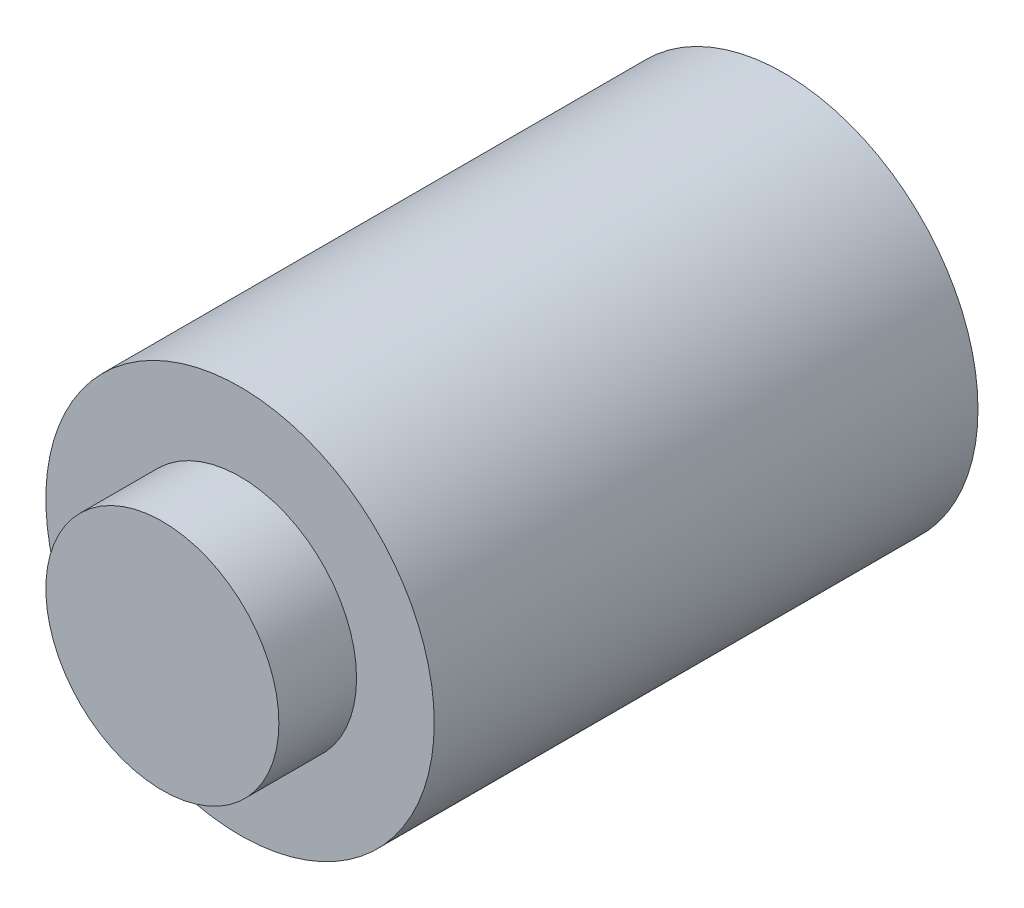
ISO-10303-21;
HEADER;
FILE_DESCRIPTION(('STEP AP214'),'2;1');
FILE_NAME('part.step','',(''),(''),'','','');
FILE_SCHEMA(('AUTOMOTIVE_DESIGN { 1 0 10303 214 1 1 1 1 }'));
ENDSEC;
DATA;
#1=APPLICATION_CONTEXT('core data for automotive mechanical design processes');
#2=APPLICATION_PROTOCOL_DEFINITION('international standard','automotive_design',2000,#1);
#3=PRODUCT_CONTEXT('',#1,'mechanical');
#4=PRODUCT('Part','Part','',(#3));
#5=PRODUCT_RELATED_PRODUCT_CATEGORY('part','',(#4));
#6=PRODUCT_DEFINITION_FORMATION('','',#4);
#7=PRODUCT_DEFINITION_CONTEXT('part definition',#1,'design');
#8=PRODUCT_DEFINITION('design','',#6,#7);
#9=PRODUCT_DEFINITION_SHAPE('','',#8);
#10=(LENGTH_UNIT() NAMED_UNIT(*) SI_UNIT(.MILLI.,.METRE.));
#11=(NAMED_UNIT(*) PLANE_ANGLE_UNIT() SI_UNIT($,.RADIAN.));
#12=(NAMED_UNIT(*) SI_UNIT($,.STERADIAN.) SOLID_ANGLE_UNIT());
#13=UNCERTAINTY_MEASURE_WITH_UNIT(LENGTH_MEASURE(1.E-05),#10,'distance_accuracy_value','');
#14=(GEOMETRIC_REPRESENTATION_CONTEXT(3) GLOBAL_UNCERTAINTY_ASSIGNED_CONTEXT((#13)) GLOBAL_UNIT_ASSIGNED_CONTEXT((#10,
#11,#12)) REPRESENTATION_CONTEXT('',''));
#15=CARTESIAN_POINT('',(0.,0.,0.));
#16=DIRECTION('',(0.,0.,1.));
#17=DIRECTION('',(1.,0.,0.));
#18=AXIS2_PLACEMENT_3D('',#15,#16,#17);
#19=CARTESIAN_POINT('',(0.,0.,14.));
#20=DIRECTION('',(0.,0.,1.));
#21=DIRECTION('',(1.,0.,0.));
#22=AXIS2_PLACEMENT_3D('',#19,#20,#21);
#23=PLANE('',#22);
#24=CARTESIAN_POINT('',(0.,0.,14.));
#25=DIRECTION('',(0.,0.,1.));
#26=DIRECTION('',(1.,0.,0.));
#27=AXIS2_PLACEMENT_3D('',#24,#25,#26);
#28=CIRCLE('',#27,5.);
#29=CARTESIAN_POINT('',(5.,0.,14.));
#30=VERTEX_POINT('',#29);
#31=EDGE_CURVE('E11',#30,#30,#28,.T.);
#32=ORIENTED_EDGE('',*,*,#31,.T.);
#33=EDGE_LOOP('',(#32));
#34=FACE_BOUND('',#33,.T.);
#35=CARTESIAN_POINT('',(0.,0.,14.));
#36=DIRECTION('',(0.,0.,1.));
#37=DIRECTION('',(1.,0.,0.));
#38=AXIS2_PLACEMENT_3D('',#35,#36,#37);
#39=CIRCLE('',#38,3.);
#40=CARTESIAN_POINT('',(3.,0.,14.));
#41=VERTEX_POINT('',#40);
#42=EDGE_CURVE('E59',#41,#41,#39,.T.);
#43=ORIENTED_EDGE('',*,*,#42,.F.);
#44=EDGE_LOOP('',(#43));
#45=FACE_BOUND('',#44,.T.);
#46=ADVANCED_FACE('F39',(#34,#45),#23,.T.);
#47=CARTESIAN_POINT('',(0.,0.,14.));
#48=DIRECTION('',(0.,0.,-1.));
#49=DIRECTION('',(-1.,0.,0.));
#50=AXIS2_PLACEMENT_3D('',#47,#48,#49);
#51=CYLINDRICAL_SURFACE('',#50,5.);
#52=ORIENTED_EDGE('',*,*,#31,.F.);
#53=EDGE_LOOP('',(#52));
#54=FACE_BOUND('',#53,.T.);
#55=CARTESIAN_POINT('',(0.,0.,0.));
#56=DIRECTION('',(0.,0.,1.));
#57=DIRECTION('',(1.,0.,0.));
#58=AXIS2_PLACEMENT_3D('',#55,#56,#57);
#59=CIRCLE('',#58,5.);
#60=CARTESIAN_POINT('',(5.,0.,0.));
#61=VERTEX_POINT('',#60);
#62=EDGE_CURVE('E43',#61,#61,#59,.T.);
#63=ORIENTED_EDGE('',*,*,#62,.T.);
#64=EDGE_LOOP('',(#63));
#65=FACE_BOUND('',#64,.T.);
#66=ADVANCED_FACE('F41',(#54,#65),#51,.T.);
#67=CARTESIAN_POINT('',(0.,0.,0.));
#68=DIRECTION('',(0.,0.,1.));
#69=DIRECTION('',(1.,0.,0.));
#70=AXIS2_PLACEMENT_3D('',#67,#68,#69);
#71=PLANE('',#70);
#72=CARTESIAN_POINT('',(0.,0.,0.));
#73=DIRECTION('',(0.,0.,-1.));
#74=DIRECTION('',(-1.,0.,0.));
#75=AXIS2_PLACEMENT_3D('',#72,#73,#74);
#76=CIRCLE('',#75,3.5);
#77=CARTESIAN_POINT('',(-3.5,0.,0.));
#78=VERTEX_POINT('',#77);
#79=EDGE_CURVE('E66',#78,#78,#76,.T.);
#80=ORIENTED_EDGE('',*,*,#79,.F.);
#81=EDGE_LOOP('',(#80));
#82=FACE_BOUND('',#81,.T.);
#83=ORIENTED_EDGE('',*,*,#62,.F.);
#84=EDGE_LOOP('',(#83));
#85=FACE_BOUND('',#84,.T.);
#86=ADVANCED_FACE('F77',(#82,#85),#71,.F.);
#87=CARTESIAN_POINT('',(0.,0.,16.));
#88=DIRECTION('',(0.,0.,-1.));
#89=DIRECTION('',(-1.,0.,0.));
#90=AXIS2_PLACEMENT_3D('',#87,#88,#89);
#91=CYLINDRICAL_SURFACE('',#90,3.);
#92=CARTESIAN_POINT('',(0.,0.,16.));
#93=DIRECTION('',(0.,0.,1.));
#94=DIRECTION('',(1.,0.,0.));
#95=AXIS2_PLACEMENT_3D('',#92,#93,#94);
#96=CIRCLE('',#95,3.);
#97=CARTESIAN_POINT('',(3.,0.,16.));
#98=VERTEX_POINT('',#97);
#99=EDGE_CURVE('E63',#98,#98,#96,.T.);
#100=ORIENTED_EDGE('',*,*,#99,.F.);
#101=EDGE_LOOP('',(#100));
#102=FACE_BOUND('',#101,.T.);
#103=ORIENTED_EDGE('',*,*,#42,.T.);
#104=EDGE_LOOP('',(#103));
#105=FACE_BOUND('',#104,.T.);
#106=ADVANCED_FACE('F79',(#102,#105),#91,.T.);
#107=CARTESIAN_POINT('',(0.,0.,16.));
#108=DIRECTION('',(0.,0.,1.));
#109=DIRECTION('',(1.,0.,0.));
#110=AXIS2_PLACEMENT_3D('',#107,#108,#109);
#111=PLANE('',#110);
#112=ORIENTED_EDGE('',*,*,#99,.T.);
#113=EDGE_LOOP('',(#112));
#114=FACE_BOUND('',#113,.T.);
#115=ADVANCED_FACE('F53',(#114),#111,.T.);
#116=CARTESIAN_POINT('',(0.,0.,5.99999999999999));
#117=DIRECTION('',(0.,0.,-1.));
#118=DIRECTION('',(-1.,0.,0.));
#119=AXIS2_PLACEMENT_3D('',#116,#117,#118);
#120=CONICAL_SURFACE('',#119,2.49999999999999,1.02974425867665);
#121=CARTESIAN_POINT('',(0.,0.,7.5021515475689));
#122=VERTEX_POINT('',#121);
#123=VERTEX_LOOP('',#122);
#124=FACE_BOUND('',#123,.T.);
#125=CARTESIAN_POINT('',(0.,0.,5.99999999999999));
#126=DIRECTION('',(0.,0.,-1.));
#127=DIRECTION('',(-1.,0.,0.));
#128=AXIS2_PLACEMENT_3D('',#125,#126,#127);
#129=CIRCLE('',#128,2.49999999999999);
#130=CARTESIAN_POINT('',(-2.49999999999999,0.,5.99999999999999));
#131=VERTEX_POINT('',#130);
#132=EDGE_CURVE('E57',#131,#131,#129,.T.);
#133=ORIENTED_EDGE('',*,*,#132,.T.);
#134=EDGE_LOOP('',(#133));
#135=FACE_BOUND('',#134,.T.);
#136=ADVANCED_FACE('F49',(#124,#135),#120,.F.);
#137=CARTESIAN_POINT('',(0.,0.,0.));
#138=DIRECTION('',(0.,0.,-1.));
#139=DIRECTION('',(-1.,0.,0.));
#140=AXIS2_PLACEMENT_3D('',#137,#138,#139);
#141=CYLINDRICAL_SURFACE('',#140,2.49999999999999);
#142=ORIENTED_EDGE('',*,*,#132,.F.);
#143=EDGE_LOOP('',(#142));
#144=FACE_BOUND('',#143,.T.);
#145=CARTESIAN_POINT('',(0.,0.,1.));
#146=DIRECTION('',(0.,0.,-1.));
#147=DIRECTION('',(-1.,0.,0.));
#148=AXIS2_PLACEMENT_3D('',#145,#146,#147);
#149=CIRCLE('',#148,2.5);
#150=CARTESIAN_POINT('',(-2.5,0.,1.));
#151=VERTEX_POINT('',#150);
#152=EDGE_CURVE('E60',#151,#151,#149,.T.);
#153=ORIENTED_EDGE('',*,*,#152,.T.);
#154=EDGE_LOOP('',(#153));
#155=FACE_BOUND('',#154,.T.);
#156=ADVANCED_FACE('F52',(#144,#155),#141,.F.);
#157=CARTESIAN_POINT('',(0.,0.,0.));
#158=DIRECTION('',(0.,0.,-1.));
#159=DIRECTION('',(-1.,0.,0.));
#160=AXIS2_PLACEMENT_3D('',#157,#158,#159);
#161=CONICAL_SURFACE('',#160,3.5,0.785398163397449);
#162=ORIENTED_EDGE('',*,*,#152,.F.);
#163=EDGE_LOOP('',(#162));
#164=FACE_BOUND('',#163,.T.);
#165=ORIENTED_EDGE('',*,*,#79,.T.);
#166=EDGE_LOOP('',(#165));
#167=FACE_BOUND('',#166,.T.);
#168=ADVANCED_FACE('F100',(#164,#167),#161,.F.);
#169=CLOSED_SHELL('',(#46,#66,#86,#106,#115,#136,#156,#168));
#170=MANIFOLD_SOLID_BREP('B2',#169);
#171=ADVANCED_BREP_SHAPE_REPRESENTATION('',(#18,#170),#14);
#172=SHAPE_DEFINITION_REPRESENTATION(#9,#171);
ENDSEC;
END-ISO-10303-21;
